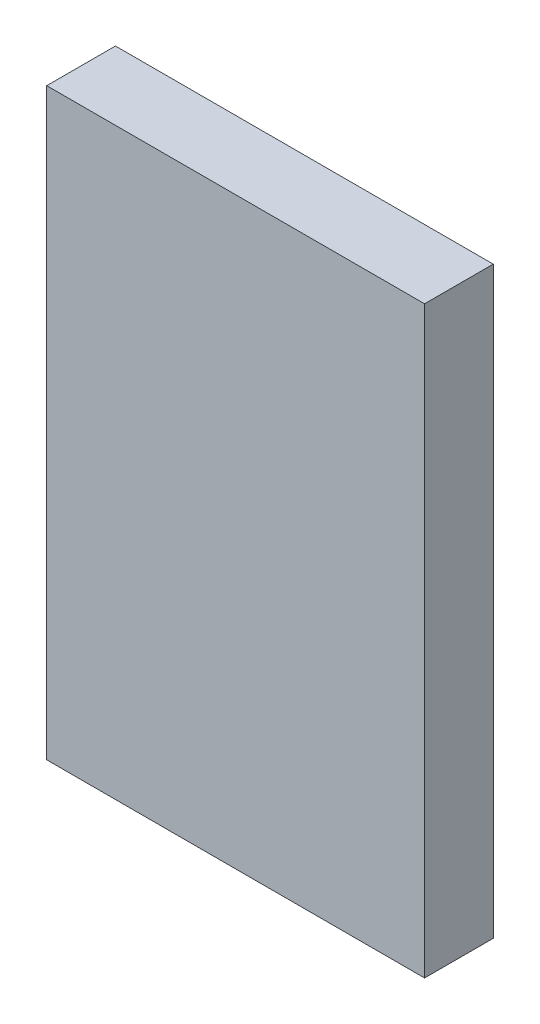
ISO-10303-21;
HEADER;
FILE_DESCRIPTION(('STEP AP214'),'2;1');
FILE_NAME('part.step','',(''),(''),'','','');
FILE_SCHEMA(('AUTOMOTIVE_DESIGN { 1 0 10303 214 1 1 1 1 }'));
ENDSEC;
DATA;
#1=APPLICATION_CONTEXT('core data for automotive mechanical design processes');
#2=APPLICATION_PROTOCOL_DEFINITION('international standard','automotive_design',2000,#1);
#3=PRODUCT_CONTEXT('',#1,'mechanical');
#4=PRODUCT('Part','Part','',(#3));
#5=PRODUCT_RELATED_PRODUCT_CATEGORY('part','',(#4));
#6=PRODUCT_DEFINITION_FORMATION('','',#4);
#7=PRODUCT_DEFINITION_CONTEXT('part definition',#1,'design');
#8=PRODUCT_DEFINITION('design','',#6,#7);
#9=PRODUCT_DEFINITION_SHAPE('','',#8);
#10=(LENGTH_UNIT() NAMED_UNIT(*) SI_UNIT(.MILLI.,.METRE.));
#11=(NAMED_UNIT(*) PLANE_ANGLE_UNIT() SI_UNIT($,.RADIAN.));
#12=(NAMED_UNIT(*) SI_UNIT($,.STERADIAN.) SOLID_ANGLE_UNIT());
#13=UNCERTAINTY_MEASURE_WITH_UNIT(LENGTH_MEASURE(1.E-05),#10,'distance_accuracy_value','');
#14=(GEOMETRIC_REPRESENTATION_CONTEXT(3) GLOBAL_UNCERTAINTY_ASSIGNED_CONTEXT((#13)) GLOBAL_UNIT_ASSIGNED_CONTEXT((#10,
#11,#12)) REPRESENTATION_CONTEXT('',''));
#15=CARTESIAN_POINT('',(0.,0.,0.));
#16=DIRECTION('',(0.,0.,1.));
#17=DIRECTION('',(1.,0.,0.));
#18=AXIS2_PLACEMENT_3D('',#15,#16,#17);
#19=CARTESIAN_POINT('',(-27.5,42.5,10.));
#20=DIRECTION('',(1.,0.,0.));
#21=DIRECTION('',(0.,0.,-1.));
#22=AXIS2_PLACEMENT_3D('',#19,#20,#21);
#23=PLANE('',#22);
#24=DIRECTION('',(0.,-1.,0.));
#25=VECTOR('',#24,1.);
#26=CARTESIAN_POINT('',(-27.5,42.5,0.));
#27=LINE('',#26,#25);
#28=CARTESIAN_POINT('',(-27.5,42.5,0.));
#29=VERTEX_POINT('',#28);
#30=CARTESIAN_POINT('',(-27.5,-42.5,0.));
#31=VERTEX_POINT('',#30);
#32=EDGE_CURVE('E107',#29,#31,#27,.T.);
#33=ORIENTED_EDGE('',*,*,#32,.T.);
#34=DIRECTION('',(0.,0.,-1.));
#35=VECTOR('',#34,1.);
#36=CARTESIAN_POINT('',(-27.5,-42.5,10.));
#37=LINE('',#36,#35);
#38=CARTESIAN_POINT('',(-27.5,-42.5,10.));
#39=VERTEX_POINT('',#38);
#40=EDGE_CURVE('E11',#39,#31,#37,.T.);
#41=ORIENTED_EDGE('',*,*,#40,.F.);
#42=DIRECTION('',(0.,-1.,0.));
#43=VECTOR('',#42,1.);
#44=CARTESIAN_POINT('',(-27.5,42.5,10.));
#45=LINE('',#44,#43);
#46=CARTESIAN_POINT('',(-27.5,42.5,10.));
#47=VERTEX_POINT('',#46);
#48=EDGE_CURVE('E91',#47,#39,#45,.T.);
#49=ORIENTED_EDGE('',*,*,#48,.F.);
#50=DIRECTION('',(0.,0.,-1.));
#51=VECTOR('',#50,1.);
#52=CARTESIAN_POINT('',(-27.5,42.5,10.));
#53=LINE('',#52,#51);
#54=EDGE_CURVE('E103',#47,#29,#53,.T.);
#55=ORIENTED_EDGE('',*,*,#54,.T.);
#56=EDGE_LOOP('',(#33,#41,#49,#55));
#57=FACE_BOUND('',#56,.T.);
#58=ADVANCED_FACE('F39',(#57),#23,.F.);
#59=CARTESIAN_POINT('',(-27.5,-42.5,10.));
#60=DIRECTION('',(0.,1.,0.));
#61=DIRECTION('',(0.,0.,1.));
#62=AXIS2_PLACEMENT_3D('',#59,#60,#61);
#63=PLANE('',#62);
#64=DIRECTION('',(1.,0.,0.));
#65=VECTOR('',#64,1.);
#66=CARTESIAN_POINT('',(-27.5,-42.5,0.));
#67=LINE('',#66,#65);
#68=CARTESIAN_POINT('',(27.5,-42.5,0.));
#69=VERTEX_POINT('',#68);
#70=EDGE_CURVE('E96',#31,#69,#67,.T.);
#71=ORIENTED_EDGE('',*,*,#70,.T.);
#72=DIRECTION('',(0.,0.,-1.));
#73=VECTOR('',#72,1.);
#74=CARTESIAN_POINT('',(27.5,-42.5,10.));
#75=LINE('',#74,#73);
#76=CARTESIAN_POINT('',(27.5,-42.5,10.));
#77=VERTEX_POINT('',#76);
#78=EDGE_CURVE('E48',#77,#69,#75,.T.);
#79=ORIENTED_EDGE('',*,*,#78,.F.);
#80=DIRECTION('',(1.,0.,0.));
#81=VECTOR('',#80,1.);
#82=CARTESIAN_POINT('',(-27.5,-42.5,10.));
#83=LINE('',#82,#81);
#84=EDGE_CURVE('E86',#39,#77,#83,.T.);
#85=ORIENTED_EDGE('',*,*,#84,.F.);
#86=ORIENTED_EDGE('',*,*,#40,.T.);
#87=EDGE_LOOP('',(#71,#79,#85,#86));
#88=FACE_BOUND('',#87,.T.);
#89=ADVANCED_FACE('F95',(#88),#63,.F.);
#90=CARTESIAN_POINT('',(27.5,42.5,10.));
#91=DIRECTION('',(-1.,0.,0.));
#92=DIRECTION('',(0.,0.,1.));
#93=AXIS2_PLACEMENT_3D('',#90,#91,#92);
#94=PLANE('',#93);
#95=DIRECTION('',(0.,1.,0.));
#96=VECTOR('',#95,1.);
#97=CARTESIAN_POINT('',(27.5,42.5,0.));
#98=LINE('',#97,#96);
#99=CARTESIAN_POINT('',(27.5,42.5,0.));
#100=VERTEX_POINT('',#99);
#101=EDGE_CURVE('E73',#69,#100,#98,.T.);
#102=ORIENTED_EDGE('',*,*,#101,.T.);
#103=DIRECTION('',(0.,0.,-1.));
#104=VECTOR('',#103,1.);
#105=CARTESIAN_POINT('',(27.5,42.5,10.));
#106=LINE('',#105,#104);
#107=CARTESIAN_POINT('',(27.5,42.5,10.));
#108=VERTEX_POINT('',#107);
#109=EDGE_CURVE('E98',#108,#100,#106,.T.);
#110=ORIENTED_EDGE('',*,*,#109,.F.);
#111=DIRECTION('',(0.,1.,0.));
#112=VECTOR('',#111,1.);
#113=CARTESIAN_POINT('',(27.5,42.5,10.));
#114=LINE('',#113,#112);
#115=EDGE_CURVE('E89',#77,#108,#114,.T.);
#116=ORIENTED_EDGE('',*,*,#115,.F.);
#117=ORIENTED_EDGE('',*,*,#78,.T.);
#118=EDGE_LOOP('',(#102,#110,#116,#117));
#119=FACE_BOUND('',#118,.T.);
#120=ADVANCED_FACE('F99',(#119),#94,.F.);
#121=CARTESIAN_POINT('',(-27.5,42.5,10.));
#122=DIRECTION('',(0.,-1.,0.));
#123=DIRECTION('',(0.,0.,-1.));
#124=AXIS2_PLACEMENT_3D('',#121,#122,#123);
#125=PLANE('',#124);
#126=DIRECTION('',(-1.,0.,0.));
#127=VECTOR('',#126,1.);
#128=CARTESIAN_POINT('',(-27.5,42.5,0.));
#129=LINE('',#128,#127);
#130=EDGE_CURVE('E79',#100,#29,#129,.T.);
#131=ORIENTED_EDGE('',*,*,#130,.T.);
#132=ORIENTED_EDGE('',*,*,#54,.F.);
#133=DIRECTION('',(-1.,0.,0.));
#134=VECTOR('',#133,1.);
#135=CARTESIAN_POINT('',(-27.5,42.5,10.));
#136=LINE('',#135,#134);
#137=EDGE_CURVE('E56',#108,#47,#136,.T.);
#138=ORIENTED_EDGE('',*,*,#137,.F.);
#139=ORIENTED_EDGE('',*,*,#109,.T.);
#140=EDGE_LOOP('',(#131,#132,#138,#139));
#141=FACE_BOUND('',#140,.T.);
#142=ADVANCED_FACE('F120',(#141),#125,.F.);
#143=CARTESIAN_POINT('',(0.,0.,10.));
#144=DIRECTION('',(0.,0.,1.));
#145=DIRECTION('',(1.,0.,0.));
#146=AXIS2_PLACEMENT_3D('',#143,#144,#145);
#147=PLANE('',#146);
#148=ORIENTED_EDGE('',*,*,#48,.T.);
#149=ORIENTED_EDGE('',*,*,#84,.T.);
#150=ORIENTED_EDGE('',*,*,#115,.T.);
#151=ORIENTED_EDGE('',*,*,#137,.T.);
#152=EDGE_LOOP('',(#148,#149,#150,#151));
#153=FACE_BOUND('',#152,.T.);
#154=ADVANCED_FACE('F87',(#153),#147,.T.);
#155=CARTESIAN_POINT('',(0.,0.,0.));
#156=DIRECTION('',(0.,0.,1.));
#157=DIRECTION('',(1.,0.,0.));
#158=AXIS2_PLACEMENT_3D('',#155,#156,#157);
#159=PLANE('',#158);
#160=ORIENTED_EDGE('',*,*,#32,.F.);
#161=ORIENTED_EDGE('',*,*,#130,.F.);
#162=ORIENTED_EDGE('',*,*,#101,.F.);
#163=ORIENTED_EDGE('',*,*,#70,.F.);
#164=EDGE_LOOP('',(#160,#161,#162,#163));
#165=FACE_BOUND('',#164,.T.);
#166=ADVANCED_FACE('F123',(#165),#159,.F.);
#167=CLOSED_SHELL('',(#58,#89,#120,#142,#154,#166));
#168=MANIFOLD_SOLID_BREP('B2',#167);
#169=ADVANCED_BREP_SHAPE_REPRESENTATION('',(#18,#168),#14);
#170=SHAPE_DEFINITION_REPRESENTATION(#9,#169);
ENDSEC;
END-ISO-10303-21;
